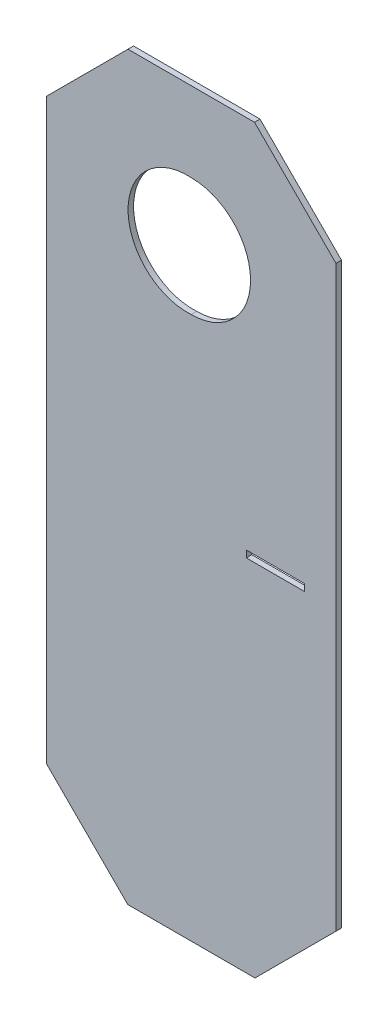
ISO-10303-21;
HEADER;
FILE_DESCRIPTION(('STEP AP214'),'2;1');
FILE_NAME('part.step','',(''),(''),'','','');
FILE_SCHEMA(('AUTOMOTIVE_DESIGN { 1 0 10303 214 1 1 1 1 }'));
ENDSEC;
DATA;
#1=APPLICATION_CONTEXT('core data for automotive mechanical design processes');
#2=APPLICATION_PROTOCOL_DEFINITION('international standard','automotive_design',2000,#1);
#3=PRODUCT_CONTEXT('',#1,'mechanical');
#4=PRODUCT('Part','Part','',(#3));
#5=PRODUCT_RELATED_PRODUCT_CATEGORY('part','',(#4));
#6=PRODUCT_DEFINITION_FORMATION('','',#4);
#7=PRODUCT_DEFINITION_CONTEXT('part definition',#1,'design');
#8=PRODUCT_DEFINITION('design','',#6,#7);
#9=PRODUCT_DEFINITION_SHAPE('','',#8);
#10=(LENGTH_UNIT() NAMED_UNIT(*) SI_UNIT(.MILLI.,.METRE.));
#11=(NAMED_UNIT(*) PLANE_ANGLE_UNIT() SI_UNIT($,.RADIAN.));
#12=(NAMED_UNIT(*) SI_UNIT($,.STERADIAN.) SOLID_ANGLE_UNIT());
#13=UNCERTAINTY_MEASURE_WITH_UNIT(LENGTH_MEASURE(1.E-05),#10,'distance_accuracy_value','');
#14=(GEOMETRIC_REPRESENTATION_CONTEXT(3) GLOBAL_UNCERTAINTY_ASSIGNED_CONTEXT((#13)) GLOBAL_UNIT_ASSIGNED_CONTEXT((#10,
#11,#12)) REPRESENTATION_CONTEXT('',''));
#15=CARTESIAN_POINT('',(0.,0.,0.));
#16=DIRECTION('',(0.,0.,1.));
#17=DIRECTION('',(1.,0.,0.));
#18=AXIS2_PLACEMENT_3D('',#15,#16,#17);
#19=CARTESIAN_POINT('',(105.082921558728,162.025080800368,4.));
#20=DIRECTION('',(-1.,0.,0.));
#21=DIRECTION('',(0.,-1.,0.));
#22=AXIS2_PLACEMENT_3D('',#19,#20,#21);
#23=PLANE('',#22);
#24=DIRECTION('',(0.,1.,0.));
#25=VECTOR('',#24,1.);
#26=CARTESIAN_POINT('',(105.082921558728,162.025080800368,0.));
#27=LINE('',#26,#25);
#28=CARTESIAN_POINT('',(105.082921558728,162.025080800368,0.));
#29=VERTEX_POINT('',#28);
#30=CARTESIAN_POINT('',(105.082921558728,581.722068253563,0.));
#31=VERTEX_POINT('',#30);
#32=EDGE_CURVE('E182',#29,#31,#27,.T.);
#33=ORIENTED_EDGE('',*,*,#32,.T.);
#34=DIRECTION('',(0.,0.,-1.));
#35=VECTOR('',#34,1.);
#36=CARTESIAN_POINT('',(105.082921558728,581.722068253563,4.));
#37=LINE('',#36,#35);
#38=CARTESIAN_POINT('',(105.082921558728,581.722068253563,4.));
#39=VERTEX_POINT('',#38);
#40=EDGE_CURVE('E11',#39,#31,#37,.T.);
#41=ORIENTED_EDGE('',*,*,#40,.F.);
#42=DIRECTION('',(0.,1.,0.));
#43=VECTOR('',#42,1.);
#44=CARTESIAN_POINT('',(105.082921558728,162.025080800368,4.));
#45=LINE('',#44,#43);
#46=CARTESIAN_POINT('',(105.082921558728,162.025080800368,4.));
#47=VERTEX_POINT('',#46);
#48=EDGE_CURVE('E185',#47,#39,#45,.T.);
#49=ORIENTED_EDGE('',*,*,#48,.F.);
#50=DIRECTION('',(0.,0.,-1.));
#51=VECTOR('',#50,1.);
#52=CARTESIAN_POINT('',(105.082921558728,162.025080800368,4.));
#53=LINE('',#52,#51);
#54=EDGE_CURVE('E203',#47,#29,#53,.T.);
#55=ORIENTED_EDGE('',*,*,#54,.T.);
#56=EDGE_LOOP('',(#33,#41,#49,#55));
#57=FACE_BOUND('',#56,.T.);
#58=ADVANCED_FACE('F32',(#57),#23,.F.);
#59=CARTESIAN_POINT('',(105.082921558728,581.722068253563,4.));
#60=DIRECTION('',(-0.707106781186548,-0.707106781186547,0.));
#61=DIRECTION('',(0.707106781186547,-0.707106781186548,0.));
#62=AXIS2_PLACEMENT_3D('',#59,#60,#61);
#63=PLANE('',#62);
#64=DIRECTION('',(-0.707106781186547,0.707106781186548,0.));
#65=VECTOR('',#64,1.);
#66=CARTESIAN_POINT('',(105.082921558728,581.722068253563,0.));
#67=LINE('',#66,#65);
#68=CARTESIAN_POINT('',(45.9790427486258,640.825947063665,0.));
#69=VERTEX_POINT('',#68);
#70=EDGE_CURVE('E206',#31,#69,#67,.T.);
#71=ORIENTED_EDGE('',*,*,#70,.T.);
#72=DIRECTION('',(0.,0.,-1.));
#73=VECTOR('',#72,1.);
#74=CARTESIAN_POINT('',(45.9790427486258,640.825947063665,4.));
#75=LINE('',#74,#73);
#76=CARTESIAN_POINT('',(45.9790427486258,640.825947063665,4.));
#77=VERTEX_POINT('',#76);
#78=EDGE_CURVE('E39',#77,#69,#75,.T.);
#79=ORIENTED_EDGE('',*,*,#78,.F.);
#80=DIRECTION('',(-0.707106781186547,0.707106781186548,0.));
#81=VECTOR('',#80,1.);
#82=CARTESIAN_POINT('',(105.082921558728,581.722068253563,4.));
#83=LINE('',#82,#81);
#84=EDGE_CURVE('E188',#39,#77,#83,.T.);
#85=ORIENTED_EDGE('',*,*,#84,.F.);
#86=ORIENTED_EDGE('',*,*,#40,.T.);
#87=EDGE_LOOP('',(#71,#79,#85,#86));
#88=FACE_BOUND('',#87,.T.);
#89=ADVANCED_FACE('F262',(#88),#63,.F.);
#90=CARTESIAN_POINT('',(45.9790427486258,640.825947063665,4.));
#91=DIRECTION('',(0.,-1.,0.));
#92=DIRECTION('',(1.,0.,0.));
#93=AXIS2_PLACEMENT_3D('',#90,#91,#92);
#94=PLANE('',#93);
#95=DIRECTION('',(-1.,0.,0.));
#96=VECTOR('',#95,1.);
#97=CARTESIAN_POINT('',(45.9790427486258,640.825947063665,0.));
#98=LINE('',#97,#96);
#99=CARTESIAN_POINT('',(-45.8131996311706,640.825947063664,0.));
#100=VERTEX_POINT('',#99);
#101=EDGE_CURVE('E208',#69,#100,#98,.T.);
#102=ORIENTED_EDGE('',*,*,#101,.T.);
#103=DIRECTION('',(0.,0.,-1.));
#104=VECTOR('',#103,1.);
#105=CARTESIAN_POINT('',(-45.8131996311706,640.825947063664,4.));
#106=LINE('',#105,#104);
#107=CARTESIAN_POINT('',(-45.8131996311706,640.825947063664,4.));
#108=VERTEX_POINT('',#107);
#109=EDGE_CURVE('E233',#108,#100,#106,.T.);
#110=ORIENTED_EDGE('',*,*,#109,.F.);
#111=DIRECTION('',(-1.,0.,0.));
#112=VECTOR('',#111,1.);
#113=CARTESIAN_POINT('',(45.9790427486258,640.825947063665,4.));
#114=LINE('',#113,#112);
#115=EDGE_CURVE('E191',#77,#108,#114,.T.);
#116=ORIENTED_EDGE('',*,*,#115,.F.);
#117=ORIENTED_EDGE('',*,*,#78,.T.);
#118=EDGE_LOOP('',(#102,#110,#116,#117));
#119=FACE_BOUND('',#118,.T.);
#120=ADVANCED_FACE('F240',(#119),#94,.F.);
#121=CARTESIAN_POINT('',(-45.8131996311706,640.825947063664,4.));
#122=DIRECTION('',(0.707106781186548,-0.707106781186547,0.));
#123=DIRECTION('',(0.707106781186547,0.707106781186548,0.));
#124=AXIS2_PLACEMENT_3D('',#121,#122,#123);
#125=PLANE('',#124);
#126=DIRECTION('',(-0.707106781186547,-0.707106781186548,0.));
#127=VECTOR('',#126,1.);
#128=CARTESIAN_POINT('',(-45.8131996311706,640.825947063664,0.));
#129=LINE('',#128,#127);
#130=CARTESIAN_POINT('',(-104.917078441272,581.722068253563,0.));
#131=VERTEX_POINT('',#130);
#132=EDGE_CURVE('E210',#100,#131,#129,.T.);
#133=ORIENTED_EDGE('',*,*,#132,.T.);
#134=DIRECTION('',(0.,0.,-1.));
#135=VECTOR('',#134,1.);
#136=CARTESIAN_POINT('',(-104.917078441272,581.722068253563,4.));
#137=LINE('',#136,#135);
#138=CARTESIAN_POINT('',(-104.917078441272,581.722068253563,4.));
#139=VERTEX_POINT('',#138);
#140=EDGE_CURVE('E230',#139,#131,#137,.T.);
#141=ORIENTED_EDGE('',*,*,#140,.F.);
#142=DIRECTION('',(-0.707106781186547,-0.707106781186548,0.));
#143=VECTOR('',#142,1.);
#144=CARTESIAN_POINT('',(-45.8131996311706,640.825947063664,4.));
#145=LINE('',#144,#143);
#146=EDGE_CURVE('E193',#108,#139,#145,.T.);
#147=ORIENTED_EDGE('',*,*,#146,.F.);
#148=ORIENTED_EDGE('',*,*,#109,.T.);
#149=EDGE_LOOP('',(#133,#141,#147,#148));
#150=FACE_BOUND('',#149,.T.);
#151=ADVANCED_FACE('F251',(#150),#125,.F.);
#152=CARTESIAN_POINT('',(-104.917078441272,581.722068253563,4.));
#153=DIRECTION('',(1.,0.,0.));
#154=DIRECTION('',(0.,1.,0.));
#155=AXIS2_PLACEMENT_3D('',#152,#153,#154);
#156=PLANE('',#155);
#157=DIRECTION('',(0.,-1.,0.));
#158=VECTOR('',#157,1.);
#159=CARTESIAN_POINT('',(-104.917078441272,581.722068253563,0.));
#160=LINE('',#159,#158);
#161=CARTESIAN_POINT('',(-104.917078441272,162.212880509357,0.));
#162=VERTEX_POINT('',#161);
#163=EDGE_CURVE('E212',#131,#162,#160,.T.);
#164=ORIENTED_EDGE('',*,*,#163,.T.);
#165=DIRECTION('',(0.,0.,-1.));
#166=VECTOR('',#165,1.);
#167=CARTESIAN_POINT('',(-104.917078441272,162.212880509357,4.));
#168=LINE('',#167,#166);
#169=CARTESIAN_POINT('',(-104.917078441272,162.212880509357,4.));
#170=VERTEX_POINT('',#169);
#171=EDGE_CURVE('E227',#170,#162,#168,.T.);
#172=ORIENTED_EDGE('',*,*,#171,.F.);
#173=DIRECTION('',(0.,-1.,0.));
#174=VECTOR('',#173,1.);
#175=CARTESIAN_POINT('',(-104.917078441272,581.722068253563,4.));
#176=LINE('',#175,#174);
#177=EDGE_CURVE('E195',#139,#170,#176,.T.);
#178=ORIENTED_EDGE('',*,*,#177,.F.);
#179=ORIENTED_EDGE('',*,*,#140,.T.);
#180=EDGE_LOOP('',(#164,#172,#178,#179));
#181=FACE_BOUND('',#180,.T.);
#182=ADVANCED_FACE('F255',(#181),#156,.F.);
#183=CARTESIAN_POINT('',(-104.917078441272,162.212880509357,4.));
#184=DIRECTION('',(0.707106781186547,0.707106781186547,0.));
#185=DIRECTION('',(-0.707106781186548,0.707106781186548,0.));
#186=AXIS2_PLACEMENT_3D('',#183,#184,#185);
#187=PLANE('',#186);
#188=DIRECTION('',(0.707106781186547,-0.707106781186547,0.));
#189=VECTOR('',#188,1.);
#190=CARTESIAN_POINT('',(-104.917078441272,162.212880509357,0.));
#191=LINE('',#190,#189);
#192=CARTESIAN_POINT('',(-45.973174510304,103.268976578389,0.));
#193=VERTEX_POINT('',#192);
#194=EDGE_CURVE('E214',#162,#193,#191,.T.);
#195=ORIENTED_EDGE('',*,*,#194,.T.);
#196=DIRECTION('',(0.,0.,-1.));
#197=VECTOR('',#196,1.);
#198=CARTESIAN_POINT('',(-45.973174510304,103.268976578389,4.));
#199=LINE('',#198,#197);
#200=CARTESIAN_POINT('',(-45.973174510304,103.268976578389,4.));
#201=VERTEX_POINT('',#200);
#202=EDGE_CURVE('E224',#201,#193,#199,.T.);
#203=ORIENTED_EDGE('',*,*,#202,.F.);
#204=DIRECTION('',(0.707106781186547,-0.707106781186547,0.));
#205=VECTOR('',#204,1.);
#206=CARTESIAN_POINT('',(-104.917078441272,162.212880509357,4.));
#207=LINE('',#206,#205);
#208=EDGE_CURVE('E197',#170,#201,#207,.T.);
#209=ORIENTED_EDGE('',*,*,#208,.F.);
#210=ORIENTED_EDGE('',*,*,#171,.T.);
#211=EDGE_LOOP('',(#195,#203,#209,#210));
#212=FACE_BOUND('',#211,.T.);
#213=ADVANCED_FACE('F275',(#212),#187,.F.);
#214=CARTESIAN_POINT('',(-45.973174510304,103.268976578389,4.));
#215=DIRECTION('',(0.,1.,0.));
#216=DIRECTION('',(0.,0.,1.));
#217=AXIS2_PLACEMENT_3D('',#214,#215,#216);
#218=PLANE('',#217);
#219=DIRECTION('',(1.,0.,0.));
#220=VECTOR('',#219,1.);
#221=CARTESIAN_POINT('',(-45.973174510304,103.268976578389,0.));
#222=LINE('',#221,#220);
#223=CARTESIAN_POINT('',(46.326817336749,103.268976578389,0.));
#224=VERTEX_POINT('',#223);
#225=EDGE_CURVE('E216',#193,#224,#222,.T.);
#226=ORIENTED_EDGE('',*,*,#225,.T.);
#227=DIRECTION('',(0.,0.,-1.));
#228=VECTOR('',#227,1.);
#229=CARTESIAN_POINT('',(46.326817336749,103.268976578389,4.));
#230=LINE('',#229,#228);
#231=CARTESIAN_POINT('',(46.326817336749,103.268976578389,4.));
#232=VERTEX_POINT('',#231);
#233=EDGE_CURVE('E221',#232,#224,#230,.T.);
#234=ORIENTED_EDGE('',*,*,#233,.F.);
#235=DIRECTION('',(1.,0.,0.));
#236=VECTOR('',#235,1.);
#237=CARTESIAN_POINT('',(-45.973174510304,103.268976578389,4.));
#238=LINE('',#237,#236);
#239=EDGE_CURVE('E199',#201,#232,#238,.T.);
#240=ORIENTED_EDGE('',*,*,#239,.F.);
#241=ORIENTED_EDGE('',*,*,#202,.T.);
#242=EDGE_LOOP('',(#226,#234,#240,#241));
#243=FACE_BOUND('',#242,.T.);
#244=ADVANCED_FACE('F273',(#243),#218,.F.);
#245=CARTESIAN_POINT('',(46.326817336749,103.268976578389,4.));
#246=DIRECTION('',(-0.707106781186548,0.707106781186547,0.));
#247=DIRECTION('',(-0.707106781186547,-0.707106781186548,0.));
#248=AXIS2_PLACEMENT_3D('',#245,#246,#247);
#249=PLANE('',#248);
#250=DIRECTION('',(0.707106781186547,0.707106781186548,0.));
#251=VECTOR('',#250,1.);
#252=CARTESIAN_POINT('',(46.326817336749,103.268976578389,0.));
#253=LINE('',#252,#251);
#254=EDGE_CURVE('E189',#224,#29,#253,.T.);
#255=ORIENTED_EDGE('',*,*,#254,.T.);
#256=ORIENTED_EDGE('',*,*,#54,.F.);
#257=DIRECTION('',(0.707106781186547,0.707106781186548,0.));
#258=VECTOR('',#257,1.);
#259=CARTESIAN_POINT('',(46.326817336749,103.268976578389,4.));
#260=LINE('',#259,#258);
#261=EDGE_CURVE('E201',#232,#47,#260,.T.);
#262=ORIENTED_EDGE('',*,*,#261,.F.);
#263=ORIENTED_EDGE('',*,*,#233,.T.);
#264=EDGE_LOOP('',(#255,#256,#262,#263));
#265=FACE_BOUND('',#264,.T.);
#266=ADVANCED_FACE('F268',(#265),#249,.F.);
#267=CARTESIAN_POINT('',(105.082921558728,640.825947063665,4.));
#268=DIRECTION('',(0.,0.,1.));
#269=DIRECTION('',(1.,0.,0.));
#270=AXIS2_PLACEMENT_3D('',#267,#268,#269);
#271=PLANE('',#270);
#272=DIRECTION('',(0.,1.,0.));
#273=VECTOR('',#272,1.);
#274=CARTESIAN_POINT('',(40.0192137486722,369.088061238249,4.));
#275=LINE('',#274,#273);
#276=CARTESIAN_POINT('',(40.0192137486722,364.088060834514,4.));
#277=VERTEX_POINT('',#276);
#278=CARTESIAN_POINT('',(40.0192137486722,369.088061238249,4.));
#279=VERTEX_POINT('',#278);
#280=EDGE_CURVE('E134',#277,#279,#275,.T.);
#281=ORIENTED_EDGE('',*,*,#280,.T.);
#282=DIRECTION('',(1.,0.,0.));
#283=VECTOR('',#282,1.);
#284=CARTESIAN_POINT('',(40.0192137486722,369.088061238249,4.));
#285=LINE('',#284,#283);
#286=CARTESIAN_POINT('',(82.1887450808775,369.088061238249,4.));
#287=VERTEX_POINT('',#286);
#288=EDGE_CURVE('E143',#279,#287,#285,.T.);
#289=ORIENTED_EDGE('',*,*,#288,.T.);
#290=DIRECTION('',(0.,-1.,0.));
#291=VECTOR('',#290,1.);
#292=CARTESIAN_POINT('',(82.1887450808775,369.088061238249,4.));
#293=LINE('',#292,#291);
#294=CARTESIAN_POINT('',(82.1887450808775,364.088060834514,4.));
#295=VERTEX_POINT('',#294);
#296=EDGE_CURVE('E46',#287,#295,#293,.T.);
#297=ORIENTED_EDGE('',*,*,#296,.T.);
#298=DIRECTION('',(-1.,0.,0.));
#299=VECTOR('',#298,1.);
#300=CARTESIAN_POINT('',(40.0192137486722,364.088060834514,4.));
#301=LINE('',#300,#299);
#302=EDGE_CURVE('E140',#295,#277,#301,.T.);
#303=ORIENTED_EDGE('',*,*,#302,.T.);
#304=EDGE_LOOP('',(#281,#289,#297,#303));
#305=FACE_BOUND('',#304,.T.);
#306=CARTESIAN_POINT('',(-2.67465205851429,540.024602251336,4.));
#307=DIRECTION('',(0.,0.,1.));
#308=DIRECTION('',(1.,0.,0.));
#309=AXIS2_PLACEMENT_3D('',#306,#307,#308);
#310=CIRCLE('',#309,43.090541621996);
#311=CARTESIAN_POINT('',(0.11726077625729,583.024602251336,4.));
#312=VERTEX_POINT('',#311);
#313=CARTESIAN_POINT('',(0.11726077625728,497.024602251336,4.));
#314=VERTEX_POINT('',#313);
#315=EDGE_CURVE('E165',#312,#314,#310,.T.);
#316=ORIENTED_EDGE('',*,*,#315,.F.);
#317=CARTESIAN_POINT('',(0.117260776257288,540.024602251336,4.));
#318=DIRECTION('',(0.,0.,1.));
#319=DIRECTION('',(1.,0.,0.));
#320=AXIS2_PLACEMENT_3D('',#317,#318,#319);
#321=CIRCLE('',#320,43.);
#322=EDGE_CURVE('E173',#314,#312,#321,.T.);
#323=ORIENTED_EDGE('',*,*,#322,.F.);
#324=EDGE_LOOP('',(#316,#323));
#325=FACE_BOUND('',#324,.T.);
#326=ORIENTED_EDGE('',*,*,#48,.T.);
#327=ORIENTED_EDGE('',*,*,#84,.T.);
#328=ORIENTED_EDGE('',*,*,#115,.T.);
#329=ORIENTED_EDGE('',*,*,#146,.T.);
#330=ORIENTED_EDGE('',*,*,#177,.T.);
#331=ORIENTED_EDGE('',*,*,#208,.T.);
#332=ORIENTED_EDGE('',*,*,#239,.T.);
#333=ORIENTED_EDGE('',*,*,#261,.T.);
#334=EDGE_LOOP('',(#326,#327,#328,#329,#330,#331,#332,#333));
#335=FACE_BOUND('',#334,.T.);
#336=ADVANCED_FACE('F147',(#305,#325,#335),#271,.T.);
#337=CARTESIAN_POINT('',(105.082921558728,640.825947063665,0.));
#338=DIRECTION('',(0.,0.,1.));
#339=DIRECTION('',(1.,0.,0.));
#340=AXIS2_PLACEMENT_3D('',#337,#338,#339);
#341=PLANE('',#340);
#342=DIRECTION('',(1.,0.,0.));
#343=VECTOR('',#342,1.);
#344=CARTESIAN_POINT('',(40.0192137486722,369.088061238249,0.));
#345=LINE('',#344,#343);
#346=CARTESIAN_POINT('',(40.0192137486722,369.088061238249,0.));
#347=VERTEX_POINT('',#346);
#348=CARTESIAN_POINT('',(82.1887450808775,369.088061238249,0.));
#349=VERTEX_POINT('',#348);
#350=EDGE_CURVE('E159',#347,#349,#345,.T.);
#351=ORIENTED_EDGE('',*,*,#350,.F.);
#352=DIRECTION('',(0.,1.,0.));
#353=VECTOR('',#352,1.);
#354=CARTESIAN_POINT('',(40.0192137486722,369.088061238249,0.));
#355=LINE('',#354,#353);
#356=CARTESIAN_POINT('',(40.0192137486722,364.088060834514,0.));
#357=VERTEX_POINT('',#356);
#358=EDGE_CURVE('E54',#357,#347,#355,.T.);
#359=ORIENTED_EDGE('',*,*,#358,.F.);
#360=DIRECTION('',(-1.,0.,0.));
#361=VECTOR('',#360,1.);
#362=CARTESIAN_POINT('',(40.0192137486722,364.088060834514,0.));
#363=LINE('',#362,#361);
#364=CARTESIAN_POINT('',(82.1887450808775,364.088060834514,0.));
#365=VERTEX_POINT('',#364);
#366=EDGE_CURVE('E150',#365,#357,#363,.T.);
#367=ORIENTED_EDGE('',*,*,#366,.F.);
#368=DIRECTION('',(0.,-1.,0.));
#369=VECTOR('',#368,1.);
#370=CARTESIAN_POINT('',(82.1887450808775,369.088061238249,0.));
#371=LINE('',#370,#369);
#372=EDGE_CURVE('E153',#349,#365,#371,.T.);
#373=ORIENTED_EDGE('',*,*,#372,.F.);
#374=EDGE_LOOP('',(#351,#359,#367,#373));
#375=FACE_BOUND('',#374,.T.);
#376=CARTESIAN_POINT('',(0.117260776257288,540.024602251336,0.));
#377=DIRECTION('',(0.,0.,1.));
#378=DIRECTION('',(1.,0.,0.));
#379=AXIS2_PLACEMENT_3D('',#376,#377,#378);
#380=CIRCLE('',#379,43.);
#381=CARTESIAN_POINT('',(0.11726077625728,497.024602251336,0.));
#382=VERTEX_POINT('',#381);
#383=CARTESIAN_POINT('',(0.11726077625729,583.024602251336,0.));
#384=VERTEX_POINT('',#383);
#385=EDGE_CURVE('E172',#382,#384,#380,.T.);
#386=ORIENTED_EDGE('',*,*,#385,.T.);
#387=CARTESIAN_POINT('',(-2.67465205851429,540.024602251336,0.));
#388=DIRECTION('',(0.,0.,1.));
#389=DIRECTION('',(1.,0.,0.));
#390=AXIS2_PLACEMENT_3D('',#387,#388,#389);
#391=CIRCLE('',#390,43.090541621996);
#392=EDGE_CURVE('E169',#384,#382,#391,.T.);
#393=ORIENTED_EDGE('',*,*,#392,.T.);
#394=EDGE_LOOP('',(#386,#393));
#395=FACE_BOUND('',#394,.T.);
#396=ORIENTED_EDGE('',*,*,#32,.F.);
#397=ORIENTED_EDGE('',*,*,#254,.F.);
#398=ORIENTED_EDGE('',*,*,#225,.F.);
#399=ORIENTED_EDGE('',*,*,#194,.F.);
#400=ORIENTED_EDGE('',*,*,#163,.F.);
#401=ORIENTED_EDGE('',*,*,#132,.F.);
#402=ORIENTED_EDGE('',*,*,#101,.F.);
#403=ORIENTED_EDGE('',*,*,#70,.F.);
#404=EDGE_LOOP('',(#396,#397,#398,#399,#400,#401,#402,#403));
#405=FACE_BOUND('',#404,.T.);
#406=ADVANCED_FACE('F246',(#375,#395,#405),#341,.F.);
#407=CARTESIAN_POINT('',(-2.67465205851429,540.024602251336,0.));
#408=DIRECTION('',(0.,0.,1.));
#409=DIRECTION('',(1.,0.,0.));
#410=AXIS2_PLACEMENT_3D('',#407,#408,#409);
#411=CYLINDRICAL_SURFACE('',#410,43.090541621996);
#412=ORIENTED_EDGE('',*,*,#315,.T.);
#413=DIRECTION('',(0.,0.,1.));
#414=VECTOR('',#413,1.);
#415=CARTESIAN_POINT('',(0.11726077625728,497.024602251336,0.));
#416=LINE('',#415,#414);
#417=EDGE_CURVE('E176',#382,#314,#416,.T.);
#418=ORIENTED_EDGE('',*,*,#417,.F.);
#419=ORIENTED_EDGE('',*,*,#392,.F.);
#420=DIRECTION('',(0.,0.,1.));
#421=VECTOR('',#420,1.);
#422=CARTESIAN_POINT('',(0.11726077625729,583.024602251336,0.));
#423=LINE('',#422,#421);
#424=EDGE_CURVE('E180',#384,#312,#423,.T.);
#425=ORIENTED_EDGE('',*,*,#424,.T.);
#426=EDGE_LOOP('',(#412,#418,#419,#425));
#427=FACE_BOUND('',#426,.T.);
#428=ADVANCED_FACE('F327',(#427),#411,.F.);
#429=CARTESIAN_POINT('',(0.117260776257288,540.024602251336,0.));
#430=DIRECTION('',(0.,0.,1.));
#431=DIRECTION('',(1.,0.,0.));
#432=AXIS2_PLACEMENT_3D('',#429,#430,#431);
#433=CYLINDRICAL_SURFACE('',#432,43.);
#434=ORIENTED_EDGE('',*,*,#322,.T.);
#435=ORIENTED_EDGE('',*,*,#424,.F.);
#436=ORIENTED_EDGE('',*,*,#385,.F.);
#437=ORIENTED_EDGE('',*,*,#417,.T.);
#438=EDGE_LOOP('',(#434,#435,#436,#437));
#439=FACE_BOUND('',#438,.T.);
#440=ADVANCED_FACE('F332',(#439),#433,.F.);
#441=CARTESIAN_POINT('',(40.0192137486722,369.088061238249,4.));
#442=DIRECTION('',(-1.,0.,0.));
#443=DIRECTION('',(0.,0.,1.));
#444=AXIS2_PLACEMENT_3D('',#441,#442,#443);
#445=PLANE('',#444);
#446=ORIENTED_EDGE('',*,*,#358,.T.);
#447=DIRECTION('',(0.,0.,-1.));
#448=VECTOR('',#447,1.);
#449=CARTESIAN_POINT('',(40.0192137486722,369.088061238249,4.));
#450=LINE('',#449,#448);
#451=EDGE_CURVE('E130',#279,#347,#450,.T.);
#452=ORIENTED_EDGE('',*,*,#451,.F.);
#453=ORIENTED_EDGE('',*,*,#280,.F.);
#454=DIRECTION('',(0.,0.,-1.));
#455=VECTOR('',#454,1.);
#456=CARTESIAN_POINT('',(40.0192137486722,364.088060834514,4.));
#457=LINE('',#456,#455);
#458=EDGE_CURVE('E163',#277,#357,#457,.T.);
#459=ORIENTED_EDGE('',*,*,#458,.T.);
#460=EDGE_LOOP('',(#446,#452,#453,#459));
#461=FACE_BOUND('',#460,.T.);
#462=ADVANCED_FACE('F132',(#461),#445,.F.);
#463=CARTESIAN_POINT('',(40.0192137486722,364.088060834514,4.));
#464=DIRECTION('',(0.,-1.,0.));
#465=DIRECTION('',(0.,0.,-1.));
#466=AXIS2_PLACEMENT_3D('',#463,#464,#465);
#467=PLANE('',#466);
#468=ORIENTED_EDGE('',*,*,#366,.T.);
#469=ORIENTED_EDGE('',*,*,#458,.F.);
#470=ORIENTED_EDGE('',*,*,#302,.F.);
#471=DIRECTION('',(0.,0.,-1.));
#472=VECTOR('',#471,1.);
#473=CARTESIAN_POINT('',(82.1887450808775,364.088060834514,4.));
#474=LINE('',#473,#472);
#475=EDGE_CURVE('E166',#295,#365,#474,.T.);
#476=ORIENTED_EDGE('',*,*,#475,.T.);
#477=EDGE_LOOP('',(#468,#469,#470,#476));
#478=FACE_BOUND('',#477,.T.);
#479=ADVANCED_FACE('F366',(#478),#467,.F.);
#480=CARTESIAN_POINT('',(82.1887450808775,369.088061238249,4.));
#481=DIRECTION('',(1.,0.,0.));
#482=DIRECTION('',(0.,0.,-1.));
#483=AXIS2_PLACEMENT_3D('',#480,#481,#482);
#484=PLANE('',#483);
#485=ORIENTED_EDGE('',*,*,#372,.T.);
#486=ORIENTED_EDGE('',*,*,#475,.F.);
#487=ORIENTED_EDGE('',*,*,#296,.F.);
#488=DIRECTION('',(0.,0.,-1.));
#489=VECTOR('',#488,1.);
#490=CARTESIAN_POINT('',(82.1887450808775,369.088061238249,4.));
#491=LINE('',#490,#489);
#492=EDGE_CURVE('E139',#287,#349,#491,.T.);
#493=ORIENTED_EDGE('',*,*,#492,.T.);
#494=EDGE_LOOP('',(#485,#486,#487,#493));
#495=FACE_BOUND('',#494,.T.);
#496=ADVANCED_FACE('F375',(#495),#484,.F.);
#497=CARTESIAN_POINT('',(40.0192137486722,369.088061238249,4.));
#498=DIRECTION('',(0.,1.,0.));
#499=DIRECTION('',(0.,0.,1.));
#500=AXIS2_PLACEMENT_3D('',#497,#498,#499);
#501=PLANE('',#500);
#502=ORIENTED_EDGE('',*,*,#350,.T.);
#503=ORIENTED_EDGE('',*,*,#492,.F.);
#504=ORIENTED_EDGE('',*,*,#288,.F.);
#505=ORIENTED_EDGE('',*,*,#451,.T.);
#506=EDGE_LOOP('',(#502,#503,#504,#505));
#507=FACE_BOUND('',#506,.T.);
#508=ADVANCED_FACE('F144',(#507),#501,.F.);
#509=CLOSED_SHELL('',(#58,#89,#120,#151,#182,#213,#244,#266,#336,#406,#428,#440,#462,#479,#496,#508));
#510=MANIFOLD_SOLID_BREP('B2',#509);
#511=ADVANCED_BREP_SHAPE_REPRESENTATION('',(#18,#510),#14);
#512=SHAPE_DEFINITION_REPRESENTATION(#9,#511);
ENDSEC;
END-ISO-10303-21;
